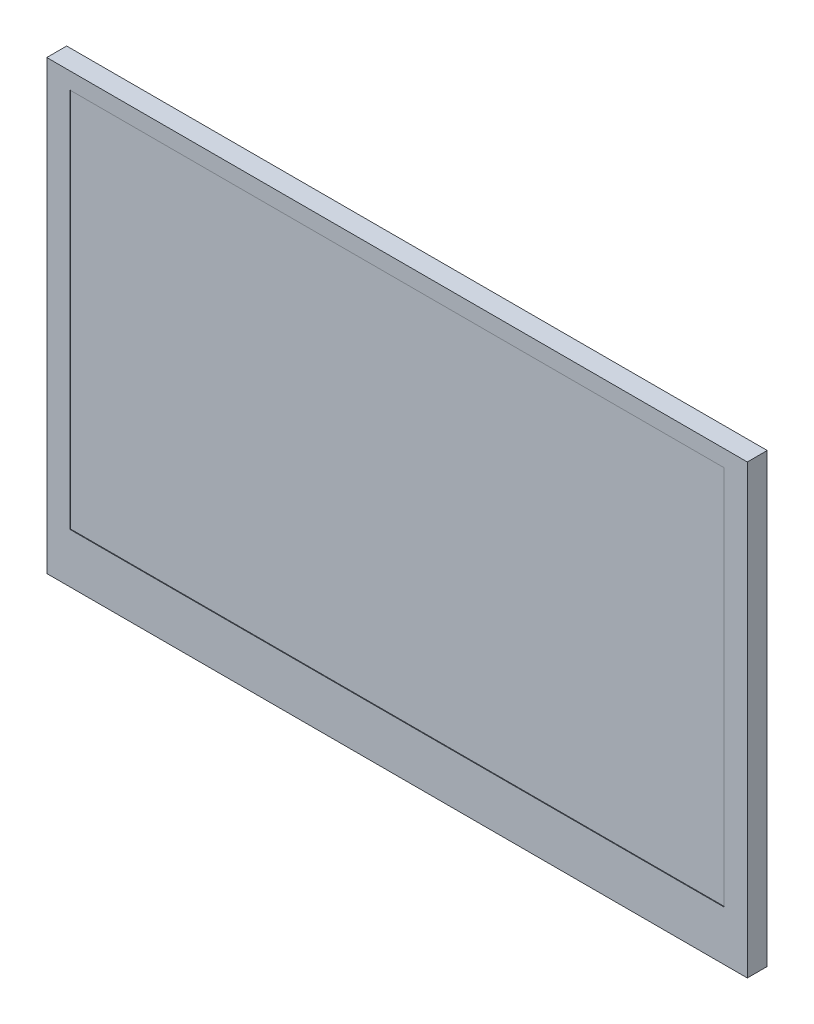
ISO-10303-21;
HEADER;
FILE_DESCRIPTION(('STEP AP214'),'2;1');
FILE_NAME('part.step','',(''),(''),'','','');
FILE_SCHEMA(('AUTOMOTIVE_DESIGN { 1 0 10303 214 1 1 1 1 }'));
ENDSEC;
DATA;
#1=APPLICATION_CONTEXT('core data for automotive mechanical design processes');
#2=APPLICATION_PROTOCOL_DEFINITION('international standard','automotive_design',2000,#1);
#3=PRODUCT_CONTEXT('',#1,'mechanical');
#4=PRODUCT('Part','Part','',(#3));
#5=PRODUCT_RELATED_PRODUCT_CATEGORY('part','',(#4));
#6=PRODUCT_DEFINITION_FORMATION('','',#4);
#7=PRODUCT_DEFINITION_CONTEXT('part definition',#1,'design');
#8=PRODUCT_DEFINITION('design','',#6,#7);
#9=PRODUCT_DEFINITION_SHAPE('','',#8);
#10=(LENGTH_UNIT() NAMED_UNIT(*) SI_UNIT(.MILLI.,.METRE.));
#11=(NAMED_UNIT(*) PLANE_ANGLE_UNIT() SI_UNIT($,.RADIAN.));
#12=(NAMED_UNIT(*) SI_UNIT($,.STERADIAN.) SOLID_ANGLE_UNIT());
#13=UNCERTAINTY_MEASURE_WITH_UNIT(LENGTH_MEASURE(1.E-05),#10,'distance_accuracy_value','');
#14=(GEOMETRIC_REPRESENTATION_CONTEXT(3) GLOBAL_UNCERTAINTY_ASSIGNED_CONTEXT((#13)) GLOBAL_UNIT_ASSIGNED_CONTEXT((#10,
#11,#12)) REPRESENTATION_CONTEXT('',''));
#15=CARTESIAN_POINT('',(0.,0.,0.));
#16=DIRECTION('',(0.,0.,1.));
#17=DIRECTION('',(1.,0.,0.));
#18=AXIS2_PLACEMENT_3D('',#15,#16,#17);
#19=CARTESIAN_POINT('',(52.75,33.65,0.));
#20=DIRECTION('',(0.,1.,0.));
#21=DIRECTION('',(0.,0.,1.));
#22=AXIS2_PLACEMENT_3D('',#19,#20,#21);
#23=PLANE('',#22);
#24=DIRECTION('',(-1.,0.,0.));
#25=VECTOR('',#24,1.);
#26=CARTESIAN_POINT('',(52.75,33.65,3.));
#27=LINE('',#26,#25);
#28=CARTESIAN_POINT('',(52.75,33.65,3.));
#29=VERTEX_POINT('',#28);
#30=CARTESIAN_POINT('',(-52.75,33.65,3.));
#31=VERTEX_POINT('',#30);
#32=EDGE_CURVE('E196',#29,#31,#27,.T.);
#33=ORIENTED_EDGE('',*,*,#32,.F.);
#34=DIRECTION('',(0.,0.,1.));
#35=VECTOR('',#34,1.);
#36=CARTESIAN_POINT('',(52.75,33.65,0.));
#37=LINE('',#36,#35);
#38=CARTESIAN_POINT('',(52.75,33.65,0.));
#39=VERTEX_POINT('',#38);
#40=EDGE_CURVE('E41',#39,#29,#37,.T.);
#41=ORIENTED_EDGE('',*,*,#40,.F.);
#42=DIRECTION('',(-1.,0.,0.));
#43=VECTOR('',#42,1.);
#44=CARTESIAN_POINT('',(52.75,33.65,0.));
#45=LINE('',#44,#43);
#46=CARTESIAN_POINT('',(-52.75,33.65,0.));
#47=VERTEX_POINT('',#46);
#48=EDGE_CURVE('E197',#39,#47,#45,.T.);
#49=ORIENTED_EDGE('',*,*,#48,.T.);
#50=DIRECTION('',(0.,0.,1.));
#51=VECTOR('',#50,1.);
#52=CARTESIAN_POINT('',(-52.75,33.65,0.));
#53=LINE('',#52,#51);
#54=EDGE_CURVE('E36',#47,#31,#53,.T.);
#55=ORIENTED_EDGE('',*,*,#54,.T.);
#56=EDGE_LOOP('',(#33,#41,#49,#55));
#57=FACE_BOUND('',#56,.T.);
#58=ADVANCED_FACE('F33',(#57),#23,.T.);
#59=CARTESIAN_POINT('',(52.75,-33.65,0.));
#60=DIRECTION('',(1.,0.,0.));
#61=DIRECTION('',(0.,1.,0.));
#62=AXIS2_PLACEMENT_3D('',#59,#60,#61);
#63=PLANE('',#62);
#64=DIRECTION('',(0.,1.,0.));
#65=VECTOR('',#64,1.);
#66=CARTESIAN_POINT('',(52.75,-33.65,3.));
#67=LINE('',#66,#65);
#68=CARTESIAN_POINT('',(52.75,-33.65,3.));
#69=VERTEX_POINT('',#68);
#70=EDGE_CURVE('E201',#69,#29,#67,.T.);
#71=ORIENTED_EDGE('',*,*,#70,.F.);
#72=DIRECTION('',(0.,0.,1.));
#73=VECTOR('',#72,1.);
#74=CARTESIAN_POINT('',(52.75,-33.65,0.));
#75=LINE('',#74,#73);
#76=CARTESIAN_POINT('',(52.75,-33.65,0.));
#77=VERTEX_POINT('',#76);
#78=EDGE_CURVE('E222',#77,#69,#75,.T.);
#79=ORIENTED_EDGE('',*,*,#78,.F.);
#80=DIRECTION('',(0.,1.,0.));
#81=VECTOR('',#80,1.);
#82=CARTESIAN_POINT('',(52.75,-33.65,0.));
#83=LINE('',#82,#81);
#84=EDGE_CURVE('E207',#77,#39,#83,.T.);
#85=ORIENTED_EDGE('',*,*,#84,.T.);
#86=ORIENTED_EDGE('',*,*,#40,.T.);
#87=EDGE_LOOP('',(#71,#79,#85,#86));
#88=FACE_BOUND('',#87,.T.);
#89=ADVANCED_FACE('F237',(#88),#63,.T.);
#90=CARTESIAN_POINT('',(-52.75,-33.65,0.));
#91=DIRECTION('',(0.,-1.,0.));
#92=DIRECTION('',(0.,0.,-1.));
#93=AXIS2_PLACEMENT_3D('',#90,#91,#92);
#94=PLANE('',#93);
#95=DIRECTION('',(0.,0.,1.));
#96=VECTOR('',#95,1.);
#97=CARTESIAN_POINT('',(12.75,-33.65,2.));
#98=LINE('',#97,#96);
#99=CARTESIAN_POINT('',(12.75,-33.65,0.));
#100=VERTEX_POINT('',#99);
#101=CARTESIAN_POINT('',(12.75,-33.65,2.));
#102=VERTEX_POINT('',#101);
#103=EDGE_CURVE('E11',#100,#102,#98,.T.);
#104=ORIENTED_EDGE('',*,*,#103,.F.);
#105=DIRECTION('',(1.,0.,0.));
#106=VECTOR('',#105,1.);
#107=CARTESIAN_POINT('',(-52.75,-33.65,0.));
#108=LINE('',#107,#106);
#109=EDGE_CURVE('E204',#100,#77,#108,.T.);
#110=ORIENTED_EDGE('',*,*,#109,.T.);
#111=ORIENTED_EDGE('',*,*,#78,.T.);
#112=DIRECTION('',(1.,0.,0.));
#113=VECTOR('',#112,1.);
#114=CARTESIAN_POINT('',(-52.75,-33.65,3.));
#115=LINE('',#114,#113);
#116=CARTESIAN_POINT('',(-52.75,-33.65,3.));
#117=VERTEX_POINT('',#116);
#118=EDGE_CURVE('E216',#117,#69,#115,.T.);
#119=ORIENTED_EDGE('',*,*,#118,.F.);
#120=DIRECTION('',(0.,0.,1.));
#121=VECTOR('',#120,1.);
#122=CARTESIAN_POINT('',(-52.75,-33.65,0.));
#123=LINE('',#122,#121);
#124=CARTESIAN_POINT('',(-52.75,-33.65,0.));
#125=VERTEX_POINT('',#124);
#126=EDGE_CURVE('E223',#125,#117,#123,.T.);
#127=ORIENTED_EDGE('',*,*,#126,.F.);
#128=CARTESIAN_POINT('',(-32.75,-33.65,0.));
#129=VERTEX_POINT('',#128);
#130=EDGE_CURVE('E205',#125,#129,#108,.T.);
#131=ORIENTED_EDGE('',*,*,#130,.T.);
#132=DIRECTION('',(0.,0.,-1.));
#133=VECTOR('',#132,1.);
#134=CARTESIAN_POINT('',(-32.75,-33.65,-8.54934526763096));
#135=LINE('',#134,#133);
#136=CARTESIAN_POINT('',(-32.75,-33.65,2.));
#137=VERTEX_POINT('',#136);
#138=EDGE_CURVE('E179',#137,#129,#135,.T.);
#139=ORIENTED_EDGE('',*,*,#138,.F.);
#140=DIRECTION('',(-1.,0.,0.));
#141=VECTOR('',#140,1.);
#142=CARTESIAN_POINT('',(-32.75,-33.65,2.));
#143=LINE('',#142,#141);
#144=EDGE_CURVE('E58',#102,#137,#143,.T.);
#145=ORIENTED_EDGE('',*,*,#144,.F.);
#146=EDGE_LOOP('',(#104,#110,#111,#119,#127,#131,#139,#145));
#147=FACE_BOUND('',#146,.T.);
#148=ADVANCED_FACE('F246',(#147),#94,.T.);
#149=CARTESIAN_POINT('',(-52.75,33.65,0.));
#150=DIRECTION('',(-1.,0.,0.));
#151=DIRECTION('',(0.,0.,1.));
#152=AXIS2_PLACEMENT_3D('',#149,#150,#151);
#153=PLANE('',#152);
#154=DIRECTION('',(0.,-1.,0.));
#155=VECTOR('',#154,1.);
#156=CARTESIAN_POINT('',(-52.75,33.65,3.));
#157=LINE('',#156,#155);
#158=EDGE_CURVE('E213',#31,#117,#157,.T.);
#159=ORIENTED_EDGE('',*,*,#158,.F.);
#160=ORIENTED_EDGE('',*,*,#54,.F.);
#161=DIRECTION('',(0.,-1.,0.));
#162=VECTOR('',#161,1.);
#163=CARTESIAN_POINT('',(-52.75,33.65,0.));
#164=LINE('',#163,#162);
#165=EDGE_CURVE('E200',#47,#125,#164,.T.);
#166=ORIENTED_EDGE('',*,*,#165,.T.);
#167=ORIENTED_EDGE('',*,*,#126,.T.);
#168=EDGE_LOOP('',(#159,#160,#166,#167));
#169=FACE_BOUND('',#168,.T.);
#170=ADVANCED_FACE('F231',(#169),#153,.T.);
#171=CARTESIAN_POINT('',(0.,0.,0.));
#172=DIRECTION('',(0.,0.,1.));
#173=DIRECTION('',(1.,0.,0.));
#174=AXIS2_PLACEMENT_3D('',#171,#172,#173);
#175=PLANE('',#174);
#176=ORIENTED_EDGE('',*,*,#48,.F.);
#177=ORIENTED_EDGE('',*,*,#84,.F.);
#178=ORIENTED_EDGE('',*,*,#109,.F.);
#179=EDGE_CURVE('E208',#129,#100,#108,.T.);
#180=ORIENTED_EDGE('',*,*,#179,.F.);
#181=ORIENTED_EDGE('',*,*,#130,.F.);
#182=ORIENTED_EDGE('',*,*,#165,.F.);
#183=EDGE_LOOP('',(#176,#177,#178,#180,#181,#182));
#184=FACE_BOUND('',#183,.T.);
#185=ADVANCED_FACE('F240',(#184),#175,.F.);
#186=CARTESIAN_POINT('',(0.,0.,3.));
#187=DIRECTION('',(0.,0.,1.));
#188=DIRECTION('',(1.,0.,0.));
#189=AXIS2_PLACEMENT_3D('',#186,#187,#188);
#190=PLANE('',#189);
#191=DIRECTION('',(0.,-1.,0.));
#192=VECTOR('',#191,1.);
#193=CARTESIAN_POINT('',(-49.25,31.15,3.));
#194=LINE('',#193,#192);
#195=CARTESIAN_POINT('',(-49.25,31.15,3.));
#196=VERTEX_POINT('',#195);
#197=CARTESIAN_POINT('',(-49.25,-26.15,3.));
#198=VERTEX_POINT('',#197);
#199=EDGE_CURVE('E50',#196,#198,#194,.T.);
#200=ORIENTED_EDGE('',*,*,#199,.F.);
#201=DIRECTION('',(-1.,0.,0.));
#202=VECTOR('',#201,1.);
#203=CARTESIAN_POINT('',(49.25,31.15,3.));
#204=LINE('',#203,#202);
#205=CARTESIAN_POINT('',(49.25,31.15,3.));
#206=VERTEX_POINT('',#205);
#207=EDGE_CURVE('E149',#206,#196,#204,.T.);
#208=ORIENTED_EDGE('',*,*,#207,.F.);
#209=DIRECTION('',(0.,1.,0.));
#210=VECTOR('',#209,1.);
#211=CARTESIAN_POINT('',(49.25,-26.15,3.));
#212=LINE('',#211,#210);
#213=CARTESIAN_POINT('',(49.25,-26.15,3.));
#214=VERTEX_POINT('',#213);
#215=EDGE_CURVE('E152',#214,#206,#212,.T.);
#216=ORIENTED_EDGE('',*,*,#215,.F.);
#217=DIRECTION('',(1.,0.,0.));
#218=VECTOR('',#217,1.);
#219=CARTESIAN_POINT('',(-49.25,-26.15,3.));
#220=LINE('',#219,#218);
#221=EDGE_CURVE('E158',#198,#214,#220,.T.);
#222=ORIENTED_EDGE('',*,*,#221,.F.);
#223=EDGE_LOOP('',(#200,#208,#216,#222));
#224=FACE_BOUND('',#223,.T.);
#225=ORIENTED_EDGE('',*,*,#32,.T.);
#226=ORIENTED_EDGE('',*,*,#158,.T.);
#227=ORIENTED_EDGE('',*,*,#118,.T.);
#228=ORIENTED_EDGE('',*,*,#70,.T.);
#229=EDGE_LOOP('',(#225,#226,#227,#228));
#230=FACE_BOUND('',#229,.T.);
#231=ADVANCED_FACE('F233',(#224,#230),#190,.T.);
#232=CARTESIAN_POINT('',(-32.75,-33.75,2.));
#233=DIRECTION('',(0.,0.,-1.));
#234=DIRECTION('',(-1.,0.,0.));
#235=AXIS2_PLACEMENT_3D('',#232,#233,#234);
#236=PLANE('',#235);
#237=ORIENTED_EDGE('',*,*,#144,.T.);
#238=DIRECTION('',(0.,1.,0.));
#239=VECTOR('',#238,1.);
#240=CARTESIAN_POINT('',(-32.75,-33.75,2.));
#241=LINE('',#240,#239);
#242=CARTESIAN_POINT('',(-32.75,-33.75,2.));
#243=VERTEX_POINT('',#242);
#244=EDGE_CURVE('E193',#243,#137,#241,.T.);
#245=ORIENTED_EDGE('',*,*,#244,.F.);
#246=DIRECTION('',(-1.,0.,0.));
#247=VECTOR('',#246,1.);
#248=CARTESIAN_POINT('',(-32.75,-33.75,2.));
#249=LINE('',#248,#247);
#250=CARTESIAN_POINT('',(12.75,-33.75,2.));
#251=VERTEX_POINT('',#250);
#252=EDGE_CURVE('E167',#251,#243,#249,.T.);
#253=ORIENTED_EDGE('',*,*,#252,.F.);
#254=DIRECTION('',(0.,1.,0.));
#255=VECTOR('',#254,1.);
#256=CARTESIAN_POINT('',(12.75,-33.75,2.));
#257=LINE('',#256,#255);
#258=EDGE_CURVE('E176',#251,#102,#257,.T.);
#259=ORIENTED_EDGE('',*,*,#258,.T.);
#260=EDGE_LOOP('',(#237,#245,#253,#259));
#261=FACE_BOUND('',#260,.T.);
#262=ADVANCED_FACE('F265',(#261),#236,.F.);
#263=CARTESIAN_POINT('',(-32.75,-33.75,-8.54934526763096));
#264=DIRECTION('',(1.,0.,0.));
#265=DIRECTION('',(0.,0.,-1.));
#266=AXIS2_PLACEMENT_3D('',#263,#264,#265);
#267=PLANE('',#266);
#268=ORIENTED_EDGE('',*,*,#138,.T.);
#269=CARTESIAN_POINT('',(-32.75,-33.65,-8.54934526763096));
#270=VERTEX_POINT('',#269);
#271=EDGE_CURVE('E178',#129,#270,#135,.T.);
#272=ORIENTED_EDGE('',*,*,#271,.T.);
#273=DIRECTION('',(0.,1.,0.));
#274=VECTOR('',#273,1.);
#275=CARTESIAN_POINT('',(-32.75,-33.75,-8.54934526763096));
#276=LINE('',#275,#274);
#277=CARTESIAN_POINT('',(-32.75,-33.75,-8.54934526763096));
#278=VERTEX_POINT('',#277);
#279=EDGE_CURVE('E190',#278,#270,#276,.T.);
#280=ORIENTED_EDGE('',*,*,#279,.F.);
#281=DIRECTION('',(0.,0.,-1.));
#282=VECTOR('',#281,1.);
#283=CARTESIAN_POINT('',(-32.75,-33.75,-8.54934526763096));
#284=LINE('',#283,#282);
#285=EDGE_CURVE('E170',#243,#278,#284,.T.);
#286=ORIENTED_EDGE('',*,*,#285,.F.);
#287=ORIENTED_EDGE('',*,*,#244,.T.);
#288=EDGE_LOOP('',(#268,#272,#280,#286,#287));
#289=FACE_BOUND('',#288,.T.);
#290=ADVANCED_FACE('F261',(#289),#267,.F.);
#291=CARTESIAN_POINT('',(12.75,-33.75,-8.54934526763096));
#292=DIRECTION('',(0.,0.,1.));
#293=DIRECTION('',(1.,0.,0.));
#294=AXIS2_PLACEMENT_3D('',#291,#292,#293);
#295=PLANE('',#294);
#296=DIRECTION('',(1.,0.,0.));
#297=VECTOR('',#296,1.);
#298=CARTESIAN_POINT('',(12.75,-33.65,-8.54934526763096));
#299=LINE('',#298,#297);
#300=CARTESIAN_POINT('',(12.75,-33.65,-8.54934526763096));
#301=VERTEX_POINT('',#300);
#302=EDGE_CURVE('E182',#270,#301,#299,.T.);
#303=ORIENTED_EDGE('',*,*,#302,.T.);
#304=DIRECTION('',(0.,1.,0.));
#305=VECTOR('',#304,1.);
#306=CARTESIAN_POINT('',(12.75,-33.75,-8.54934526763096));
#307=LINE('',#306,#305);
#308=CARTESIAN_POINT('',(12.75,-33.75,-8.54934526763096));
#309=VERTEX_POINT('',#308);
#310=EDGE_CURVE('E187',#309,#301,#307,.T.);
#311=ORIENTED_EDGE('',*,*,#310,.F.);
#312=DIRECTION('',(1.,0.,0.));
#313=VECTOR('',#312,1.);
#314=CARTESIAN_POINT('',(12.75,-33.75,-8.54934526763096));
#315=LINE('',#314,#313);
#316=EDGE_CURVE('E172',#278,#309,#315,.T.);
#317=ORIENTED_EDGE('',*,*,#316,.F.);
#318=ORIENTED_EDGE('',*,*,#279,.T.);
#319=EDGE_LOOP('',(#303,#311,#317,#318));
#320=FACE_BOUND('',#319,.T.);
#321=ADVANCED_FACE('F258',(#320),#295,.F.);
#322=CARTESIAN_POINT('',(12.75,-33.75,2.));
#323=DIRECTION('',(-1.,0.,0.));
#324=DIRECTION('',(0.,0.,1.));
#325=AXIS2_PLACEMENT_3D('',#322,#323,#324);
#326=PLANE('',#325);
#327=EDGE_CURVE('E43',#301,#100,#98,.T.);
#328=ORIENTED_EDGE('',*,*,#327,.T.);
#329=ORIENTED_EDGE('',*,*,#103,.T.);
#330=ORIENTED_EDGE('',*,*,#258,.F.);
#331=DIRECTION('',(0.,0.,1.));
#332=VECTOR('',#331,1.);
#333=CARTESIAN_POINT('',(12.75,-33.75,2.));
#334=LINE('',#333,#332);
#335=EDGE_CURVE('E174',#309,#251,#334,.T.);
#336=ORIENTED_EDGE('',*,*,#335,.F.);
#337=ORIENTED_EDGE('',*,*,#310,.T.);
#338=EDGE_LOOP('',(#328,#329,#330,#336,#337));
#339=FACE_BOUND('',#338,.T.);
#340=ADVANCED_FACE('F252',(#339),#326,.F.);
#341=CARTESIAN_POINT('',(0.,-33.75,0.));
#342=DIRECTION('',(0.,1.,0.));
#343=DIRECTION('',(0.,0.,1.));
#344=AXIS2_PLACEMENT_3D('',#341,#342,#343);
#345=PLANE('',#344);
#346=ORIENTED_EDGE('',*,*,#252,.T.);
#347=ORIENTED_EDGE('',*,*,#285,.T.);
#348=ORIENTED_EDGE('',*,*,#316,.T.);
#349=ORIENTED_EDGE('',*,*,#335,.T.);
#350=EDGE_LOOP('',(#346,#347,#348,#349));
#351=FACE_BOUND('',#350,.T.);
#352=ADVANCED_FACE('F267',(#351),#345,.F.);
#353=CARTESIAN_POINT('',(0.,-33.65,0.));
#354=DIRECTION('',(0.,1.,0.));
#355=DIRECTION('',(0.,0.,1.));
#356=AXIS2_PLACEMENT_3D('',#353,#354,#355);
#357=PLANE('',#356);
#358=ORIENTED_EDGE('',*,*,#271,.F.);
#359=ORIENTED_EDGE('',*,*,#179,.T.);
#360=ORIENTED_EDGE('',*,*,#327,.F.);
#361=ORIENTED_EDGE('',*,*,#302,.F.);
#362=EDGE_LOOP('',(#358,#359,#360,#361));
#363=FACE_BOUND('',#362,.T.);
#364=ADVANCED_FACE('F249',(#363),#357,.T.);
#365=CARTESIAN_POINT('',(-49.25,31.15,2.9));
#366=DIRECTION('',(-1.,0.,0.));
#367=DIRECTION('',(0.,-1.,0.));
#368=AXIS2_PLACEMENT_3D('',#365,#366,#367);
#369=PLANE('',#368);
#370=ORIENTED_EDGE('',*,*,#199,.T.);
#371=DIRECTION('',(0.,0.,1.));
#372=VECTOR('',#371,1.);
#373=CARTESIAN_POINT('',(-49.25,-26.15,2.9));
#374=LINE('',#373,#372);
#375=CARTESIAN_POINT('',(-49.25,-26.15,2.9));
#376=VERTEX_POINT('',#375);
#377=EDGE_CURVE('E127',#376,#198,#374,.T.);
#378=ORIENTED_EDGE('',*,*,#377,.F.);
#379=DIRECTION('',(0.,-1.,0.));
#380=VECTOR('',#379,1.);
#381=CARTESIAN_POINT('',(-49.25,31.15,2.9));
#382=LINE('',#381,#380);
#383=CARTESIAN_POINT('',(-49.25,31.15,2.9));
#384=VERTEX_POINT('',#383);
#385=EDGE_CURVE('E131',#384,#376,#382,.T.);
#386=ORIENTED_EDGE('',*,*,#385,.F.);
#387=DIRECTION('',(0.,0.,1.));
#388=VECTOR('',#387,1.);
#389=CARTESIAN_POINT('',(-49.25,31.15,2.9));
#390=LINE('',#389,#388);
#391=EDGE_CURVE('E162',#384,#196,#390,.T.);
#392=ORIENTED_EDGE('',*,*,#391,.T.);
#393=EDGE_LOOP('',(#370,#378,#386,#392));
#394=FACE_BOUND('',#393,.T.);
#395=ADVANCED_FACE('F129',(#394),#369,.F.);
#396=CARTESIAN_POINT('',(49.25,31.15,2.9));
#397=DIRECTION('',(0.,1.,0.));
#398=DIRECTION('',(0.,0.,1.));
#399=AXIS2_PLACEMENT_3D('',#396,#397,#398);
#400=PLANE('',#399);
#401=ORIENTED_EDGE('',*,*,#207,.T.);
#402=ORIENTED_EDGE('',*,*,#391,.F.);
#403=DIRECTION('',(-1.,0.,0.));
#404=VECTOR('',#403,1.);
#405=CARTESIAN_POINT('',(49.25,31.15,2.9));
#406=LINE('',#405,#404);
#407=CARTESIAN_POINT('',(49.25,31.15,2.9));
#408=VERTEX_POINT('',#407);
#409=EDGE_CURVE('E137',#408,#384,#406,.T.);
#410=ORIENTED_EDGE('',*,*,#409,.F.);
#411=DIRECTION('',(0.,0.,1.));
#412=VECTOR('',#411,1.);
#413=CARTESIAN_POINT('',(49.25,31.15,2.9));
#414=LINE('',#413,#412);
#415=EDGE_CURVE('E164',#408,#206,#414,.T.);
#416=ORIENTED_EDGE('',*,*,#415,.T.);
#417=EDGE_LOOP('',(#401,#402,#410,#416));
#418=FACE_BOUND('',#417,.T.);
#419=ADVANCED_FACE('F337',(#418),#400,.F.);
#420=CARTESIAN_POINT('',(49.25,-26.15,2.9));
#421=DIRECTION('',(1.,0.,0.));
#422=DIRECTION('',(0.,0.,-1.));
#423=AXIS2_PLACEMENT_3D('',#420,#421,#422);
#424=PLANE('',#423);
#425=ORIENTED_EDGE('',*,*,#215,.T.);
#426=ORIENTED_EDGE('',*,*,#415,.F.);
#427=DIRECTION('',(0.,1.,0.));
#428=VECTOR('',#427,1.);
#429=CARTESIAN_POINT('',(49.25,-26.15,2.9));
#430=LINE('',#429,#428);
#431=CARTESIAN_POINT('',(49.25,-26.15,2.9));
#432=VERTEX_POINT('',#431);
#433=EDGE_CURVE('E145',#432,#408,#430,.T.);
#434=ORIENTED_EDGE('',*,*,#433,.F.);
#435=DIRECTION('',(0.,0.,1.));
#436=VECTOR('',#435,1.);
#437=CARTESIAN_POINT('',(49.25,-26.15,2.9));
#438=LINE('',#437,#436);
#439=EDGE_CURVE('E136',#432,#214,#438,.T.);
#440=ORIENTED_EDGE('',*,*,#439,.T.);
#441=EDGE_LOOP('',(#425,#426,#434,#440));
#442=FACE_BOUND('',#441,.T.);
#443=ADVANCED_FACE('F345',(#442),#424,.F.);
#444=CARTESIAN_POINT('',(-49.25,-26.15,2.9));
#445=DIRECTION('',(0.,-1.,0.));
#446=DIRECTION('',(0.,0.,-1.));
#447=AXIS2_PLACEMENT_3D('',#444,#445,#446);
#448=PLANE('',#447);
#449=ORIENTED_EDGE('',*,*,#221,.T.);
#450=ORIENTED_EDGE('',*,*,#439,.F.);
#451=DIRECTION('',(1.,0.,0.));
#452=VECTOR('',#451,1.);
#453=CARTESIAN_POINT('',(-49.25,-26.15,2.9));
#454=LINE('',#453,#452);
#455=EDGE_CURVE('E140',#376,#432,#454,.T.);
#456=ORIENTED_EDGE('',*,*,#455,.F.);
#457=ORIENTED_EDGE('',*,*,#377,.T.);
#458=EDGE_LOOP('',(#449,#450,#456,#457));
#459=FACE_BOUND('',#458,.T.);
#460=ADVANCED_FACE('F141',(#459),#448,.F.);
#461=CARTESIAN_POINT('',(0.,0.,2.9));
#462=DIRECTION('',(0.,0.,1.));
#463=DIRECTION('',(1.,0.,0.));
#464=AXIS2_PLACEMENT_3D('',#461,#462,#463);
#465=PLANE('',#464);
#466=ORIENTED_EDGE('',*,*,#385,.T.);
#467=ORIENTED_EDGE('',*,*,#455,.T.);
#468=ORIENTED_EDGE('',*,*,#433,.T.);
#469=ORIENTED_EDGE('',*,*,#409,.T.);
#470=EDGE_LOOP('',(#466,#467,#468,#469));
#471=FACE_BOUND('',#470,.T.);
#472=ADVANCED_FACE('F147',(#471),#465,.T.);
#473=CLOSED_SHELL('',(#58,#89,#148,#170,#185,#231,#262,#290,#321,#340,#352,#364,#395,#419,#443,
#460,#472));
#474=MANIFOLD_SOLID_BREP('B2',#473);
#475=ADVANCED_BREP_SHAPE_REPRESENTATION('',(#18,#474),#14);
#476=SHAPE_DEFINITION_REPRESENTATION(#9,#475);
ENDSEC;
END-ISO-10303-21;
